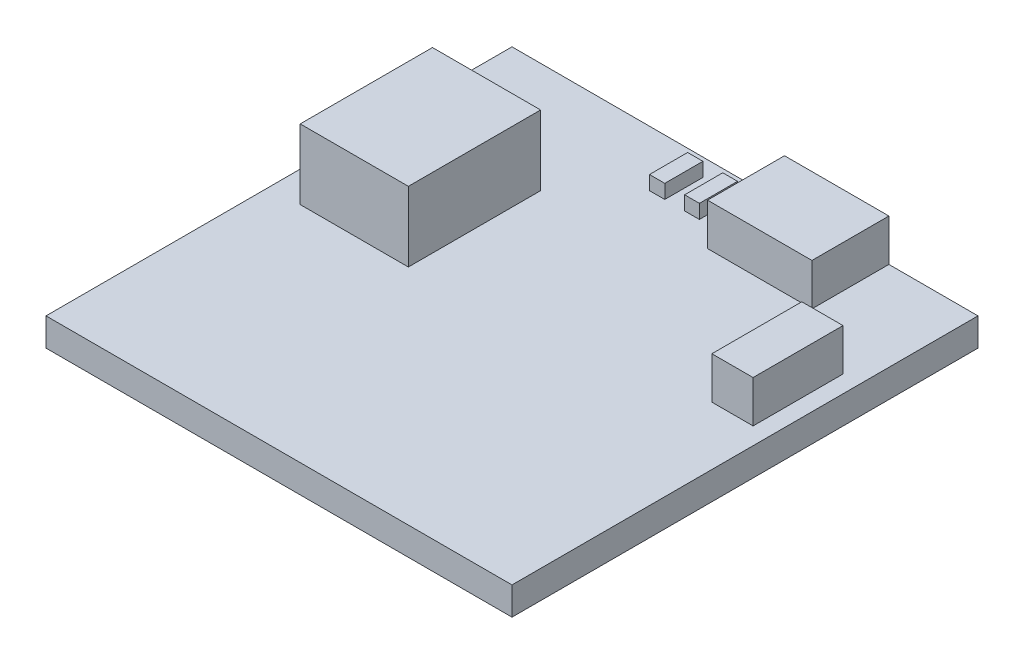
ISO-10303-21;
HEADER;
FILE_DESCRIPTION(('STEP AP214'),'2;1');
FILE_NAME('part.step','',(''),(''),'','','');
FILE_SCHEMA(('AUTOMOTIVE_DESIGN { 1 0 10303 214 1 1 1 1 }'));
ENDSEC;
DATA;
#1=APPLICATION_CONTEXT('core data for automotive mechanical design processes');
#2=APPLICATION_PROTOCOL_DEFINITION('international standard','automotive_design',2000,#1);
#3=PRODUCT_CONTEXT('',#1,'mechanical');
#4=PRODUCT('Part','Part','',(#3));
#5=PRODUCT_RELATED_PRODUCT_CATEGORY('part','',(#4));
#6=PRODUCT_DEFINITION_FORMATION('','',#4);
#7=PRODUCT_DEFINITION_CONTEXT('part definition',#1,'design');
#8=PRODUCT_DEFINITION('design','',#6,#7);
#9=PRODUCT_DEFINITION_SHAPE('','',#8);
#10=(LENGTH_UNIT() NAMED_UNIT(*) SI_UNIT(.MILLI.,.METRE.));
#11=(NAMED_UNIT(*) PLANE_ANGLE_UNIT() SI_UNIT($,.RADIAN.));
#12=(NAMED_UNIT(*) SI_UNIT($,.STERADIAN.) SOLID_ANGLE_UNIT());
#13=UNCERTAINTY_MEASURE_WITH_UNIT(LENGTH_MEASURE(1.E-05),#10,'distance_accuracy_value','');
#14=(GEOMETRIC_REPRESENTATION_CONTEXT(3) GLOBAL_UNCERTAINTY_ASSIGNED_CONTEXT((#13)) GLOBAL_UNIT_ASSIGNED_CONTEXT((#10,
#11,#12)) REPRESENTATION_CONTEXT('',''));
#15=CARTESIAN_POINT('',(0.,0.,0.));
#16=DIRECTION('',(0.,0.,1.));
#17=DIRECTION('',(1.,0.,0.));
#18=AXIS2_PLACEMENT_3D('',#15,#16,#17);
#19=CARTESIAN_POINT('',(0.,2.,0.));
#20=DIRECTION('',(0.,-1.,0.));
#21=DIRECTION('',(0.,0.,-1.));
#22=AXIS2_PLACEMENT_3D('',#19,#20,#21);
#23=PLANE('',#22);
#24=DIRECTION('',(0.,0.,1.));
#25=VECTOR('',#24,1.);
#26=CARTESIAN_POINT('',(16.3428825691909,2.,-32.0730091965515));
#27=LINE('',#26,#25);
#28=CARTESIAN_POINT('',(16.3428825691909,2.,-32.0730091965515));
#29=VERTEX_POINT('',#28);
#30=CARTESIAN_POINT('',(16.3428825691909,2.,-29.343463743615));
#31=VERTEX_POINT('',#30);
#32=EDGE_CURVE('E216',#29,#31,#27,.T.);
#33=ORIENTED_EDGE('',*,*,#32,.F.);
#34=DIRECTION('',(-1.,0.,0.));
#35=VECTOR('',#34,1.);
#36=CARTESIAN_POINT('',(16.3428825691909,2.,-32.0730091965515));
#37=LINE('',#36,#35);
#38=CARTESIAN_POINT('',(17.3998755148403,2.,-32.0730091965515));
#39=VERTEX_POINT('',#38);
#40=EDGE_CURVE('E229',#39,#29,#37,.T.);
#41=ORIENTED_EDGE('',*,*,#40,.F.);
#42=DIRECTION('',(0.,0.,-1.));
#43=VECTOR('',#42,1.);
#44=CARTESIAN_POINT('',(17.3998755148403,2.,-32.0730091965515));
#45=LINE('',#44,#43);
#46=CARTESIAN_POINT('',(17.3998755148403,2.,-29.343463743615));
#47=VERTEX_POINT('',#46);
#48=EDGE_CURVE('E238',#47,#39,#45,.T.);
#49=ORIENTED_EDGE('',*,*,#48,.F.);
#50=DIRECTION('',(1.,0.,0.));
#51=VECTOR('',#50,1.);
#52=CARTESIAN_POINT('',(16.3428825691909,2.,-29.343463743615));
#53=LINE('',#52,#51);
#54=EDGE_CURVE('E219',#31,#47,#53,.T.);
#55=ORIENTED_EDGE('',*,*,#54,.F.);
#56=EDGE_LOOP('',(#33,#41,#49,#55));
#57=FACE_BOUND('',#56,.T.);
#58=DIRECTION('',(0.,0.,1.));
#59=VECTOR('',#58,1.);
#60=CARTESIAN_POINT('',(29.164191470116,2.,-24.907830622567));
#61=LINE('',#60,#59);
#62=CARTESIAN_POINT('',(29.164191470116,2.,-24.907830622567));
#63=VERTEX_POINT('',#62);
#64=CARTESIAN_POINT('',(29.164191470116,2.,-18.471844319663));
#65=VERTEX_POINT('',#64);
#66=EDGE_CURVE('E287',#63,#65,#61,.T.);
#67=ORIENTED_EDGE('',*,*,#66,.F.);
#68=DIRECTION('',(-1.,0.,0.));
#69=VECTOR('',#68,1.);
#70=CARTESIAN_POINT('',(29.164191470116,2.,-24.907830622567));
#71=LINE('',#70,#69);
#72=CARTESIAN_POINT('',(32.1120457232311,2.,-24.907830622567));
#73=VERTEX_POINT('',#72);
#74=EDGE_CURVE('E292',#73,#63,#71,.T.);
#75=ORIENTED_EDGE('',*,*,#74,.F.);
#76=DIRECTION('',(0.,0.,-1.));
#77=VECTOR('',#76,1.);
#78=CARTESIAN_POINT('',(32.1120457232311,2.,-24.907830622567));
#79=LINE('',#78,#77);
#80=CARTESIAN_POINT('',(32.1120457232311,2.,-18.471844319663));
#81=VERTEX_POINT('',#80);
#82=EDGE_CURVE('E304',#81,#73,#79,.T.);
#83=ORIENTED_EDGE('',*,*,#82,.F.);
#84=DIRECTION('',(1.,0.,0.));
#85=VECTOR('',#84,1.);
#86=CARTESIAN_POINT('',(29.164191470116,2.,-18.471844319663));
#87=LINE('',#86,#85);
#88=EDGE_CURVE('E301',#65,#81,#87,.T.);
#89=ORIENTED_EDGE('',*,*,#88,.F.);
#90=EDGE_LOOP('',(#67,#75,#83,#89));
#91=FACE_BOUND('',#90,.T.);
#92=DIRECTION('',(0.,0.,1.));
#93=VECTOR('',#92,1.);
#94=CARTESIAN_POINT('',(2.19932214853813,2.,-25.448709163399));
#95=LINE('',#94,#93);
#96=CARTESIAN_POINT('',(2.19932214853813,2.,-25.448709163399));
#97=VERTEX_POINT('',#96);
#98=CARTESIAN_POINT('',(2.19932214853813,2.,-15.9873637144443));
#99=VERTEX_POINT('',#98);
#100=EDGE_CURVE('E320',#97,#99,#95,.T.);
#101=ORIENTED_EDGE('',*,*,#100,.F.);
#102=DIRECTION('',(-1.,0.,0.));
#103=VECTOR('',#102,1.);
#104=CARTESIAN_POINT('',(2.19932214853813,2.,-25.448709163399));
#105=LINE('',#104,#103);
#106=CARTESIAN_POINT('',(9.93540559789352,2.,-25.448709163399));
#107=VERTEX_POINT('',#106);
#108=EDGE_CURVE('E325',#107,#97,#105,.T.);
#109=ORIENTED_EDGE('',*,*,#108,.F.);
#110=DIRECTION('',(0.,0.,-1.));
#111=VECTOR('',#110,1.);
#112=CARTESIAN_POINT('',(9.93540559789352,2.,-25.448709163399));
#113=LINE('',#112,#111);
#114=CARTESIAN_POINT('',(9.93540559789352,2.,-15.9873637144443));
#115=VERTEX_POINT('',#114);
#116=EDGE_CURVE('E337',#115,#107,#113,.T.);
#117=ORIENTED_EDGE('',*,*,#116,.F.);
#118=DIRECTION('',(1.,0.,0.));
#119=VECTOR('',#118,1.);
#120=CARTESIAN_POINT('',(2.19932214853813,2.,-15.9873637144443));
#121=LINE('',#120,#119);
#122=EDGE_CURVE('E334',#99,#115,#121,.T.);
#123=ORIENTED_EDGE('',*,*,#122,.F.);
#124=EDGE_LOOP('',(#101,#109,#117,#123));
#125=FACE_BOUND('',#124,.T.);
#126=DIRECTION('',(0.,0.,1.));
#127=VECTOR('',#126,1.);
#128=CARTESIAN_POINT('',(13.8287826634453,2.,-32.0730091965515));
#129=LINE('',#128,#127);
#130=CARTESIAN_POINT('',(13.8287826634453,2.,-32.0730091965515));
#131=VERTEX_POINT('',#130);
#132=CARTESIAN_POINT('',(13.8287826634453,2.,-29.343463743615));
#133=VERTEX_POINT('',#132);
#134=EDGE_CURVE('E254',#131,#133,#129,.T.);
#135=ORIENTED_EDGE('',*,*,#134,.F.);
#136=DIRECTION('',(-1.,0.,0.));
#137=VECTOR('',#136,1.);
#138=CARTESIAN_POINT('',(13.8287826634453,2.,-32.0730091965515));
#139=LINE('',#138,#137);
#140=CARTESIAN_POINT('',(14.9221740487633,2.,-32.0730091965515));
#141=VERTEX_POINT('',#140);
#142=EDGE_CURVE('E259',#141,#131,#139,.T.);
#143=ORIENTED_EDGE('',*,*,#142,.F.);
#144=DIRECTION('',(0.,0.,-1.));
#145=VECTOR('',#144,1.);
#146=CARTESIAN_POINT('',(14.9221740487633,2.,-32.0730091965515));
#147=LINE('',#146,#145);
#148=CARTESIAN_POINT('',(14.9221740487633,2.,-29.343463743615));
#149=VERTEX_POINT('',#148);
#150=EDGE_CURVE('E271',#149,#141,#147,.T.);
#151=ORIENTED_EDGE('',*,*,#150,.F.);
#152=DIRECTION('',(1.,0.,0.));
#153=VECTOR('',#152,1.);
#154=CARTESIAN_POINT('',(13.8287826634453,2.,-29.343463743615));
#155=LINE('',#154,#153);
#156=EDGE_CURVE('E268',#133,#149,#155,.T.);
#157=ORIENTED_EDGE('',*,*,#156,.F.);
#158=EDGE_LOOP('',(#135,#143,#151,#157));
#159=FACE_BOUND('',#158,.T.);
#160=DIRECTION('',(0.,0.,1.));
#161=VECTOR('',#160,1.);
#162=CARTESIAN_POINT('',(19.4955277753479,2.,-27.8321206305776));
#163=LINE('',#162,#161);
#164=CARTESIAN_POINT('',(19.4955277753479,2.,-33.3375));
#165=VERTEX_POINT('',#164);
#166=CARTESIAN_POINT('',(19.4955277753479,2.,-27.8321206305776));
#167=VERTEX_POINT('',#166);
#168=EDGE_CURVE('E215',#165,#167,#163,.T.);
#169=ORIENTED_EDGE('',*,*,#168,.F.);
#170=DIRECTION('',(-1.,0.,0.));
#171=VECTOR('',#170,1.);
#172=CARTESIAN_POINT('',(0.,2.,-33.3375));
#173=LINE('',#172,#171);
#174=CARTESIAN_POINT('',(0.,2.,-33.3375));
#175=VERTEX_POINT('',#174);
#176=EDGE_CURVE('E362',#165,#175,#173,.T.);
#177=ORIENTED_EDGE('',*,*,#176,.T.);
#178=DIRECTION('',(0.,0.,1.));
#179=VECTOR('',#178,1.);
#180=CARTESIAN_POINT('',(0.,2.,0.));
#181=LINE('',#180,#179);
#182=CARTESIAN_POINT('',(0.,2.,0.));
#183=VERTEX_POINT('',#182);
#184=EDGE_CURVE('E354',#175,#183,#181,.T.);
#185=ORIENTED_EDGE('',*,*,#184,.T.);
#186=DIRECTION('',(1.,0.,0.));
#187=VECTOR('',#186,1.);
#188=CARTESIAN_POINT('',(0.,2.,0.));
#189=LINE('',#188,#187);
#190=CARTESIAN_POINT('',(33.3375,2.,0.));
#191=VERTEX_POINT('',#190);
#192=EDGE_CURVE('E357',#183,#191,#189,.T.);
#193=ORIENTED_EDGE('',*,*,#192,.T.);
#194=DIRECTION('',(0.,0.,-1.));
#195=VECTOR('',#194,1.);
#196=CARTESIAN_POINT('',(33.3375,2.,0.));
#197=LINE('',#196,#195);
#198=CARTESIAN_POINT('',(33.3375,2.,-33.3375));
#199=VERTEX_POINT('',#198);
#200=EDGE_CURVE('E360',#191,#199,#197,.T.);
#201=ORIENTED_EDGE('',*,*,#200,.T.);
#202=CARTESIAN_POINT('',(26.9636112351321,2.,-33.3375));
#203=VERTEX_POINT('',#202);
#204=EDGE_CURVE('E363',#199,#203,#173,.T.);
#205=ORIENTED_EDGE('',*,*,#204,.T.);
#206=DIRECTION('',(0.,0.,-1.));
#207=VECTOR('',#206,1.);
#208=CARTESIAN_POINT('',(26.9636112351321,2.,-27.8321206305776));
#209=LINE('',#208,#207);
#210=CARTESIAN_POINT('',(26.9636112351321,2.,-27.8321206305776));
#211=VERTEX_POINT('',#210);
#212=EDGE_CURVE('E54',#211,#203,#209,.T.);
#213=ORIENTED_EDGE('',*,*,#212,.F.);
#214=DIRECTION('',(1.,0.,0.));
#215=VECTOR('',#214,1.);
#216=CARTESIAN_POINT('',(19.4955277753479,2.,-27.8321206305776));
#217=LINE('',#216,#215);
#218=EDGE_CURVE('E49',#167,#211,#217,.T.);
#219=ORIENTED_EDGE('',*,*,#218,.F.);
#220=EDGE_LOOP('',(#169,#177,#185,#193,#201,#205,#213,#219));
#221=FACE_BOUND('',#220,.T.);
#222=ADVANCED_FACE('F34',(#57,#91,#125,#159,#221),#23,.F.);
#223=CARTESIAN_POINT('',(0.,2.,0.));
#224=DIRECTION('',(1.,0.,0.));
#225=DIRECTION('',(0.,0.,-1.));
#226=AXIS2_PLACEMENT_3D('',#223,#224,#225);
#227=PLANE('',#226);
#228=DIRECTION('',(0.,0.,1.));
#229=VECTOR('',#228,1.);
#230=CARTESIAN_POINT('',(0.,0.,0.));
#231=LINE('',#230,#229);
#232=CARTESIAN_POINT('',(0.,0.,-33.3375));
#233=VERTEX_POINT('',#232);
#234=CARTESIAN_POINT('',(0.,0.,0.));
#235=VERTEX_POINT('',#234);
#236=EDGE_CURVE('E353',#233,#235,#231,.T.);
#237=ORIENTED_EDGE('',*,*,#236,.T.);
#238=DIRECTION('',(0.,-1.,0.));
#239=VECTOR('',#238,1.);
#240=CARTESIAN_POINT('',(0.,2.,0.));
#241=LINE('',#240,#239);
#242=EDGE_CURVE('E11',#183,#235,#241,.T.);
#243=ORIENTED_EDGE('',*,*,#242,.F.);
#244=ORIENTED_EDGE('',*,*,#184,.F.);
#245=DIRECTION('',(0.,-1.,0.));
#246=VECTOR('',#245,1.);
#247=CARTESIAN_POINT('',(0.,2.,-33.3375));
#248=LINE('',#247,#246);
#249=EDGE_CURVE('E365',#175,#233,#248,.T.);
#250=ORIENTED_EDGE('',*,*,#249,.T.);
#251=EDGE_LOOP('',(#237,#243,#244,#250));
#252=FACE_BOUND('',#251,.T.);
#253=ADVANCED_FACE('F36',(#252),#227,.F.);
#254=CARTESIAN_POINT('',(0.,2.,0.));
#255=DIRECTION('',(0.,0.,-1.));
#256=DIRECTION('',(-1.,0.,0.));
#257=AXIS2_PLACEMENT_3D('',#254,#255,#256);
#258=PLANE('',#257);
#259=DIRECTION('',(1.,0.,0.));
#260=VECTOR('',#259,1.);
#261=CARTESIAN_POINT('',(0.,0.,0.));
#262=LINE('',#261,#260);
#263=CARTESIAN_POINT('',(33.3375,0.,0.));
#264=VERTEX_POINT('',#263);
#265=EDGE_CURVE('E368',#235,#264,#262,.T.);
#266=ORIENTED_EDGE('',*,*,#265,.T.);
#267=DIRECTION('',(0.,-1.,0.));
#268=VECTOR('',#267,1.);
#269=CARTESIAN_POINT('',(33.3375,2.,0.));
#270=LINE('',#269,#268);
#271=EDGE_CURVE('E42',#191,#264,#270,.T.);
#272=ORIENTED_EDGE('',*,*,#271,.F.);
#273=ORIENTED_EDGE('',*,*,#192,.F.);
#274=ORIENTED_EDGE('',*,*,#242,.T.);
#275=EDGE_LOOP('',(#266,#272,#273,#274));
#276=FACE_BOUND('',#275,.T.);
#277=ADVANCED_FACE('F421',(#276),#258,.F.);
#278=CARTESIAN_POINT('',(33.3375,2.,0.));
#279=DIRECTION('',(-1.,0.,0.));
#280=DIRECTION('',(0.,0.,1.));
#281=AXIS2_PLACEMENT_3D('',#278,#279,#280);
#282=PLANE('',#281);
#283=DIRECTION('',(0.,0.,-1.));
#284=VECTOR('',#283,1.);
#285=CARTESIAN_POINT('',(33.3375,0.,0.));
#286=LINE('',#285,#284);
#287=CARTESIAN_POINT('',(33.3375,0.,-33.3375));
#288=VERTEX_POINT('',#287);
#289=EDGE_CURVE('E370',#264,#288,#286,.T.);
#290=ORIENTED_EDGE('',*,*,#289,.T.);
#291=DIRECTION('',(0.,-1.,0.));
#292=VECTOR('',#291,1.);
#293=CARTESIAN_POINT('',(33.3375,2.,-33.3375));
#294=LINE('',#293,#292);
#295=EDGE_CURVE('E375',#199,#288,#294,.T.);
#296=ORIENTED_EDGE('',*,*,#295,.F.);
#297=ORIENTED_EDGE('',*,*,#200,.F.);
#298=ORIENTED_EDGE('',*,*,#271,.T.);
#299=EDGE_LOOP('',(#290,#296,#297,#298));
#300=FACE_BOUND('',#299,.T.);
#301=ADVANCED_FACE('F382',(#300),#282,.F.);
#302=CARTESIAN_POINT('',(0.,2.,-33.3375));
#303=DIRECTION('',(0.,0.,1.));
#304=DIRECTION('',(1.,0.,0.));
#305=AXIS2_PLACEMENT_3D('',#302,#303,#304);
#306=PLANE('',#305);
#307=DIRECTION('',(-1.,0.,0.));
#308=VECTOR('',#307,1.);
#309=CARTESIAN_POINT('',(0.,0.,-33.3375));
#310=LINE('',#309,#308);
#311=EDGE_CURVE('E358',#288,#233,#310,.T.);
#312=ORIENTED_EDGE('',*,*,#311,.T.);
#313=ORIENTED_EDGE('',*,*,#249,.F.);
#314=ORIENTED_EDGE('',*,*,#176,.F.);
#315=DIRECTION('',(0.,-1.,0.));
#316=VECTOR('',#315,1.);
#317=CARTESIAN_POINT('',(19.4955277753479,5.,-33.3375));
#318=LINE('',#317,#316);
#319=CARTESIAN_POINT('',(19.4955277753479,5.,-33.3375));
#320=VERTEX_POINT('',#319);
#321=EDGE_CURVE('E396',#320,#165,#318,.T.);
#322=ORIENTED_EDGE('',*,*,#321,.F.);
#323=DIRECTION('',(-1.,0.,0.));
#324=VECTOR('',#323,1.);
#325=CARTESIAN_POINT('',(19.4955277753479,5.,-33.3375));
#326=LINE('',#325,#324);
#327=CARTESIAN_POINT('',(26.9636112351321,5.,-33.3375));
#328=VERTEX_POINT('',#327);
#329=EDGE_CURVE('E209',#328,#320,#326,.T.);
#330=ORIENTED_EDGE('',*,*,#329,.F.);
#331=DIRECTION('',(0.,-1.,0.));
#332=VECTOR('',#331,1.);
#333=CARTESIAN_POINT('',(26.9636112351321,5.,-33.3375));
#334=LINE('',#333,#332);
#335=EDGE_CURVE('E221',#328,#203,#334,.T.);
#336=ORIENTED_EDGE('',*,*,#335,.T.);
#337=ORIENTED_EDGE('',*,*,#204,.F.);
#338=ORIENTED_EDGE('',*,*,#295,.T.);
#339=EDGE_LOOP('',(#312,#313,#314,#322,#330,#336,#337,#338));
#340=FACE_BOUND('',#339,.T.);
#341=ADVANCED_FACE('F391',(#340),#306,.F.);
#342=CARTESIAN_POINT('',(0.,0.,0.));
#343=DIRECTION('',(0.,-1.,0.));
#344=DIRECTION('',(0.,0.,-1.));
#345=AXIS2_PLACEMENT_3D('',#342,#343,#344);
#346=PLANE('',#345);
#347=ORIENTED_EDGE('',*,*,#236,.F.);
#348=ORIENTED_EDGE('',*,*,#311,.F.);
#349=ORIENTED_EDGE('',*,*,#289,.F.);
#350=ORIENTED_EDGE('',*,*,#265,.F.);
#351=EDGE_LOOP('',(#347,#348,#349,#350));
#352=FACE_BOUND('',#351,.T.);
#353=ADVANCED_FACE('F388',(#352),#346,.T.);
#354=CARTESIAN_POINT('',(2.19932214853813,7.,-25.448709163399));
#355=DIRECTION('',(1.,0.,0.));
#356=DIRECTION('',(0.,0.,-1.));
#357=AXIS2_PLACEMENT_3D('',#354,#355,#356);
#358=PLANE('',#357);
#359=ORIENTED_EDGE('',*,*,#100,.T.);
#360=DIRECTION('',(0.,-1.,0.));
#361=VECTOR('',#360,1.);
#362=CARTESIAN_POINT('',(2.19932214853813,7.,-15.9873637144443));
#363=LINE('',#362,#361);
#364=CARTESIAN_POINT('',(2.19932214853813,7.,-15.9873637144443));
#365=VERTEX_POINT('',#364);
#366=EDGE_CURVE('E350',#365,#99,#363,.T.);
#367=ORIENTED_EDGE('',*,*,#366,.F.);
#368=DIRECTION('',(0.,0.,1.));
#369=VECTOR('',#368,1.);
#370=CARTESIAN_POINT('',(2.19932214853813,7.,-25.448709163399));
#371=LINE('',#370,#369);
#372=CARTESIAN_POINT('',(2.19932214853813,7.,-25.448709163399));
#373=VERTEX_POINT('',#372);
#374=EDGE_CURVE('E321',#373,#365,#371,.T.);
#375=ORIENTED_EDGE('',*,*,#374,.F.);
#376=DIRECTION('',(0.,-1.,0.));
#377=VECTOR('',#376,1.);
#378=CARTESIAN_POINT('',(2.19932214853813,7.,-25.448709163399));
#379=LINE('',#378,#377);
#380=EDGE_CURVE('E331',#373,#97,#379,.T.);
#381=ORIENTED_EDGE('',*,*,#380,.T.);
#382=EDGE_LOOP('',(#359,#367,#375,#381));
#383=FACE_BOUND('',#382,.T.);
#384=ADVANCED_FACE('F425',(#383),#358,.F.);
#385=CARTESIAN_POINT('',(2.19932214853813,7.,-15.9873637144443));
#386=DIRECTION('',(0.,0.,-1.));
#387=DIRECTION('',(-1.,0.,0.));
#388=AXIS2_PLACEMENT_3D('',#385,#386,#387);
#389=PLANE('',#388);
#390=ORIENTED_EDGE('',*,*,#122,.T.);
#391=DIRECTION('',(0.,-1.,0.));
#392=VECTOR('',#391,1.);
#393=CARTESIAN_POINT('',(9.93540559789352,7.,-15.9873637144443));
#394=LINE('',#393,#392);
#395=CARTESIAN_POINT('',(9.93540559789352,7.,-15.9873637144443));
#396=VERTEX_POINT('',#395);
#397=EDGE_CURVE('E347',#396,#115,#394,.T.);
#398=ORIENTED_EDGE('',*,*,#397,.F.);
#399=DIRECTION('',(1.,0.,0.));
#400=VECTOR('',#399,1.);
#401=CARTESIAN_POINT('',(2.19932214853813,7.,-15.9873637144443));
#402=LINE('',#401,#400);
#403=EDGE_CURVE('E324',#365,#396,#402,.T.);
#404=ORIENTED_EDGE('',*,*,#403,.F.);
#405=ORIENTED_EDGE('',*,*,#366,.T.);
#406=EDGE_LOOP('',(#390,#398,#404,#405));
#407=FACE_BOUND('',#406,.T.);
#408=ADVANCED_FACE('F458',(#407),#389,.F.);
#409=CARTESIAN_POINT('',(9.93540559789352,7.,-25.448709163399));
#410=DIRECTION('',(-1.,0.,0.));
#411=DIRECTION('',(0.,0.,1.));
#412=AXIS2_PLACEMENT_3D('',#409,#410,#411);
#413=PLANE('',#412);
#414=ORIENTED_EDGE('',*,*,#116,.T.);
#415=DIRECTION('',(0.,-1.,0.));
#416=VECTOR('',#415,1.);
#417=CARTESIAN_POINT('',(9.93540559789352,7.,-25.448709163399));
#418=LINE('',#417,#416);
#419=CARTESIAN_POINT('',(9.93540559789352,7.,-25.448709163399));
#420=VERTEX_POINT('',#419);
#421=EDGE_CURVE('E344',#420,#107,#418,.T.);
#422=ORIENTED_EDGE('',*,*,#421,.F.);
#423=DIRECTION('',(0.,0.,-1.));
#424=VECTOR('',#423,1.);
#425=CARTESIAN_POINT('',(9.93540559789352,7.,-25.448709163399));
#426=LINE('',#425,#424);
#427=EDGE_CURVE('E327',#396,#420,#426,.T.);
#428=ORIENTED_EDGE('',*,*,#427,.F.);
#429=ORIENTED_EDGE('',*,*,#397,.T.);
#430=EDGE_LOOP('',(#414,#422,#428,#429));
#431=FACE_BOUND('',#430,.T.);
#432=ADVANCED_FACE('F465',(#431),#413,.F.);
#433=CARTESIAN_POINT('',(2.19932214853813,7.,-25.448709163399));
#434=DIRECTION('',(0.,0.,1.));
#435=DIRECTION('',(1.,0.,0.));
#436=AXIS2_PLACEMENT_3D('',#433,#434,#435);
#437=PLANE('',#436);
#438=ORIENTED_EDGE('',*,*,#108,.T.);
#439=ORIENTED_EDGE('',*,*,#380,.F.);
#440=DIRECTION('',(-1.,0.,0.));
#441=VECTOR('',#440,1.);
#442=CARTESIAN_POINT('',(2.19932214853813,7.,-25.448709163399));
#443=LINE('',#442,#441);
#444=EDGE_CURVE('E329',#420,#373,#443,.T.);
#445=ORIENTED_EDGE('',*,*,#444,.F.);
#446=ORIENTED_EDGE('',*,*,#421,.T.);
#447=EDGE_LOOP('',(#438,#439,#445,#446));
#448=FACE_BOUND('',#447,.T.);
#449=ADVANCED_FACE('F471',(#448),#437,.F.);
#450=CARTESIAN_POINT('',(0.,7.,0.));
#451=DIRECTION('',(0.,1.,0.));
#452=DIRECTION('',(0.,0.,1.));
#453=AXIS2_PLACEMENT_3D('',#450,#451,#452);
#454=PLANE('',#453);
#455=ORIENTED_EDGE('',*,*,#374,.T.);
#456=ORIENTED_EDGE('',*,*,#403,.T.);
#457=ORIENTED_EDGE('',*,*,#427,.T.);
#458=ORIENTED_EDGE('',*,*,#444,.T.);
#459=EDGE_LOOP('',(#455,#456,#457,#458));
#460=FACE_BOUND('',#459,.T.);
#461=ADVANCED_FACE('F479',(#460),#454,.T.);
#462=CARTESIAN_POINT('',(29.164191470116,5.,-24.907830622567));
#463=DIRECTION('',(1.,0.,0.));
#464=DIRECTION('',(0.,0.,-1.));
#465=AXIS2_PLACEMENT_3D('',#462,#463,#464);
#466=PLANE('',#465);
#467=ORIENTED_EDGE('',*,*,#66,.T.);
#468=DIRECTION('',(0.,-1.,0.));
#469=VECTOR('',#468,1.);
#470=CARTESIAN_POINT('',(29.164191470116,5.,-18.471844319663));
#471=LINE('',#470,#469);
#472=CARTESIAN_POINT('',(29.164191470116,5.,-18.471844319663));
#473=VERTEX_POINT('',#472);
#474=EDGE_CURVE('E317',#473,#65,#471,.T.);
#475=ORIENTED_EDGE('',*,*,#474,.F.);
#476=DIRECTION('',(0.,0.,1.));
#477=VECTOR('',#476,1.);
#478=CARTESIAN_POINT('',(29.164191470116,5.,-24.907830622567));
#479=LINE('',#478,#477);
#480=CARTESIAN_POINT('',(29.164191470116,5.,-24.907830622567));
#481=VERTEX_POINT('',#480);
#482=EDGE_CURVE('E288',#481,#473,#479,.T.);
#483=ORIENTED_EDGE('',*,*,#482,.F.);
#484=DIRECTION('',(0.,-1.,0.));
#485=VECTOR('',#484,1.);
#486=CARTESIAN_POINT('',(29.164191470116,5.,-24.907830622567));
#487=LINE('',#486,#485);
#488=EDGE_CURVE('E298',#481,#63,#487,.T.);
#489=ORIENTED_EDGE('',*,*,#488,.T.);
#490=EDGE_LOOP('',(#467,#475,#483,#489));
#491=FACE_BOUND('',#490,.T.);
#492=ADVANCED_FACE('F487',(#491),#466,.F.);
#493=CARTESIAN_POINT('',(29.164191470116,5.,-18.471844319663));
#494=DIRECTION('',(0.,0.,-1.));
#495=DIRECTION('',(-1.,0.,0.));
#496=AXIS2_PLACEMENT_3D('',#493,#494,#495);
#497=PLANE('',#496);
#498=ORIENTED_EDGE('',*,*,#88,.T.);
#499=DIRECTION('',(0.,-1.,0.));
#500=VECTOR('',#499,1.);
#501=CARTESIAN_POINT('',(32.1120457232311,5.,-18.471844319663));
#502=LINE('',#501,#500);
#503=CARTESIAN_POINT('',(32.1120457232311,5.,-18.471844319663));
#504=VERTEX_POINT('',#503);
#505=EDGE_CURVE('E314',#504,#81,#502,.T.);
#506=ORIENTED_EDGE('',*,*,#505,.F.);
#507=DIRECTION('',(1.,0.,0.));
#508=VECTOR('',#507,1.);
#509=CARTESIAN_POINT('',(29.164191470116,5.,-18.471844319663));
#510=LINE('',#509,#508);
#511=EDGE_CURVE('E291',#473,#504,#510,.T.);
#512=ORIENTED_EDGE('',*,*,#511,.F.);
#513=ORIENTED_EDGE('',*,*,#474,.T.);
#514=EDGE_LOOP('',(#498,#506,#512,#513));
#515=FACE_BOUND('',#514,.T.);
#516=ADVANCED_FACE('F496',(#515),#497,.F.);
#517=CARTESIAN_POINT('',(32.1120457232311,5.,-24.907830622567));
#518=DIRECTION('',(-1.,0.,0.));
#519=DIRECTION('',(0.,0.,1.));
#520=AXIS2_PLACEMENT_3D('',#517,#518,#519);
#521=PLANE('',#520);
#522=ORIENTED_EDGE('',*,*,#82,.T.);
#523=DIRECTION('',(0.,-1.,0.));
#524=VECTOR('',#523,1.);
#525=CARTESIAN_POINT('',(32.1120457232311,5.,-24.907830622567));
#526=LINE('',#525,#524);
#527=CARTESIAN_POINT('',(32.1120457232311,5.,-24.907830622567));
#528=VERTEX_POINT('',#527);
#529=EDGE_CURVE('E311',#528,#73,#526,.T.);
#530=ORIENTED_EDGE('',*,*,#529,.F.);
#531=DIRECTION('',(0.,0.,-1.));
#532=VECTOR('',#531,1.);
#533=CARTESIAN_POINT('',(32.1120457232311,5.,-24.907830622567));
#534=LINE('',#533,#532);
#535=EDGE_CURVE('E294',#504,#528,#534,.T.);
#536=ORIENTED_EDGE('',*,*,#535,.F.);
#537=ORIENTED_EDGE('',*,*,#505,.T.);
#538=EDGE_LOOP('',(#522,#530,#536,#537));
#539=FACE_BOUND('',#538,.T.);
#540=ADVANCED_FACE('F504',(#539),#521,.F.);
#541=CARTESIAN_POINT('',(29.164191470116,5.,-24.907830622567));
#542=DIRECTION('',(0.,0.,1.));
#543=DIRECTION('',(1.,0.,0.));
#544=AXIS2_PLACEMENT_3D('',#541,#542,#543);
#545=PLANE('',#544);
#546=ORIENTED_EDGE('',*,*,#74,.T.);
#547=ORIENTED_EDGE('',*,*,#488,.F.);
#548=DIRECTION('',(-1.,0.,0.));
#549=VECTOR('',#548,1.);
#550=CARTESIAN_POINT('',(29.164191470116,5.,-24.907830622567));
#551=LINE('',#550,#549);
#552=EDGE_CURVE('E296',#528,#481,#551,.T.);
#553=ORIENTED_EDGE('',*,*,#552,.F.);
#554=ORIENTED_EDGE('',*,*,#529,.T.);
#555=EDGE_LOOP('',(#546,#547,#553,#554));
#556=FACE_BOUND('',#555,.T.);
#557=ADVANCED_FACE('F512',(#556),#545,.F.);
#558=CARTESIAN_POINT('',(0.,5.,0.));
#559=DIRECTION('',(0.,1.,0.));
#560=DIRECTION('',(0.,0.,1.));
#561=AXIS2_PLACEMENT_3D('',#558,#559,#560);
#562=PLANE('',#561);
#563=ORIENTED_EDGE('',*,*,#482,.T.);
#564=ORIENTED_EDGE('',*,*,#511,.T.);
#565=ORIENTED_EDGE('',*,*,#535,.T.);
#566=ORIENTED_EDGE('',*,*,#552,.T.);
#567=EDGE_LOOP('',(#563,#564,#565,#566));
#568=FACE_BOUND('',#567,.T.);
#569=ADVANCED_FACE('F519',(#568),#562,.T.);
#570=CARTESIAN_POINT('',(13.8287826634453,3.,-32.0730091965515));
#571=DIRECTION('',(1.,0.,0.));
#572=DIRECTION('',(0.,0.,-1.));
#573=AXIS2_PLACEMENT_3D('',#570,#571,#572);
#574=PLANE('',#573);
#575=ORIENTED_EDGE('',*,*,#134,.T.);
#576=DIRECTION('',(0.,-1.,0.));
#577=VECTOR('',#576,1.);
#578=CARTESIAN_POINT('',(13.8287826634453,3.,-29.343463743615));
#579=LINE('',#578,#577);
#580=CARTESIAN_POINT('',(13.8287826634453,3.,-29.343463743615));
#581=VERTEX_POINT('',#580);
#582=EDGE_CURVE('E284',#581,#133,#579,.T.);
#583=ORIENTED_EDGE('',*,*,#582,.F.);
#584=DIRECTION('',(0.,0.,1.));
#585=VECTOR('',#584,1.);
#586=CARTESIAN_POINT('',(13.8287826634453,3.,-32.0730091965515));
#587=LINE('',#586,#585);
#588=CARTESIAN_POINT('',(13.8287826634453,3.,-32.0730091965515));
#589=VERTEX_POINT('',#588);
#590=EDGE_CURVE('E255',#589,#581,#587,.T.);
#591=ORIENTED_EDGE('',*,*,#590,.F.);
#592=DIRECTION('',(0.,-1.,0.));
#593=VECTOR('',#592,1.);
#594=CARTESIAN_POINT('',(13.8287826634453,3.,-32.0730091965515));
#595=LINE('',#594,#593);
#596=EDGE_CURVE('E265',#589,#131,#595,.T.);
#597=ORIENTED_EDGE('',*,*,#596,.T.);
#598=EDGE_LOOP('',(#575,#583,#591,#597));
#599=FACE_BOUND('',#598,.T.);
#600=ADVANCED_FACE('F527',(#599),#574,.F.);
#601=CARTESIAN_POINT('',(13.8287826634453,3.,-29.343463743615));
#602=DIRECTION('',(0.,0.,-1.));
#603=DIRECTION('',(-1.,0.,0.));
#604=AXIS2_PLACEMENT_3D('',#601,#602,#603);
#605=PLANE('',#604);
#606=ORIENTED_EDGE('',*,*,#156,.T.);
#607=DIRECTION('',(0.,-1.,0.));
#608=VECTOR('',#607,1.);
#609=CARTESIAN_POINT('',(14.9221740487633,3.,-29.343463743615));
#610=LINE('',#609,#608);
#611=CARTESIAN_POINT('',(14.9221740487633,3.,-29.343463743615));
#612=VERTEX_POINT('',#611);
#613=EDGE_CURVE('E281',#612,#149,#610,.T.);
#614=ORIENTED_EDGE('',*,*,#613,.F.);
#615=DIRECTION('',(1.,0.,0.));
#616=VECTOR('',#615,1.);
#617=CARTESIAN_POINT('',(13.8287826634453,3.,-29.343463743615));
#618=LINE('',#617,#616);
#619=EDGE_CURVE('E258',#581,#612,#618,.T.);
#620=ORIENTED_EDGE('',*,*,#619,.F.);
#621=ORIENTED_EDGE('',*,*,#582,.T.);
#622=EDGE_LOOP('',(#606,#614,#620,#621));
#623=FACE_BOUND('',#622,.T.);
#624=ADVANCED_FACE('F536',(#623),#605,.F.);
#625=CARTESIAN_POINT('',(14.9221740487633,3.,-32.0730091965515));
#626=DIRECTION('',(-1.,0.,0.));
#627=DIRECTION('',(0.,0.,1.));
#628=AXIS2_PLACEMENT_3D('',#625,#626,#627);
#629=PLANE('',#628);
#630=ORIENTED_EDGE('',*,*,#150,.T.);
#631=DIRECTION('',(0.,-1.,0.));
#632=VECTOR('',#631,1.);
#633=CARTESIAN_POINT('',(14.9221740487633,3.,-32.0730091965515));
#634=LINE('',#633,#632);
#635=CARTESIAN_POINT('',(14.9221740487633,3.,-32.0730091965515));
#636=VERTEX_POINT('',#635);
#637=EDGE_CURVE('E278',#636,#141,#634,.T.);
#638=ORIENTED_EDGE('',*,*,#637,.F.);
#639=DIRECTION('',(0.,0.,-1.));
#640=VECTOR('',#639,1.);
#641=CARTESIAN_POINT('',(14.9221740487633,3.,-32.0730091965515));
#642=LINE('',#641,#640);
#643=EDGE_CURVE('E261',#612,#636,#642,.T.);
#644=ORIENTED_EDGE('',*,*,#643,.F.);
#645=ORIENTED_EDGE('',*,*,#613,.T.);
#646=EDGE_LOOP('',(#630,#638,#644,#645));
#647=FACE_BOUND('',#646,.T.);
#648=ADVANCED_FACE('F545',(#647),#629,.F.);
#649=CARTESIAN_POINT('',(13.8287826634453,3.,-32.0730091965515));
#650=DIRECTION('',(0.,0.,1.));
#651=DIRECTION('',(1.,0.,0.));
#652=AXIS2_PLACEMENT_3D('',#649,#650,#651);
#653=PLANE('',#652);
#654=ORIENTED_EDGE('',*,*,#142,.T.);
#655=ORIENTED_EDGE('',*,*,#596,.F.);
#656=DIRECTION('',(-1.,0.,0.));
#657=VECTOR('',#656,1.);
#658=CARTESIAN_POINT('',(13.8287826634453,3.,-32.0730091965515));
#659=LINE('',#658,#657);
#660=EDGE_CURVE('E263',#636,#589,#659,.T.);
#661=ORIENTED_EDGE('',*,*,#660,.F.);
#662=ORIENTED_EDGE('',*,*,#637,.T.);
#663=EDGE_LOOP('',(#654,#655,#661,#662));
#664=FACE_BOUND('',#663,.T.);
#665=ADVANCED_FACE('F553',(#664),#653,.F.);
#666=CARTESIAN_POINT('',(0.,3.,0.));
#667=DIRECTION('',(0.,1.,0.));
#668=DIRECTION('',(0.,0.,1.));
#669=AXIS2_PLACEMENT_3D('',#666,#667,#668);
#670=PLANE('',#669);
#671=ORIENTED_EDGE('',*,*,#590,.T.);
#672=ORIENTED_EDGE('',*,*,#619,.T.);
#673=ORIENTED_EDGE('',*,*,#643,.T.);
#674=ORIENTED_EDGE('',*,*,#660,.T.);
#675=EDGE_LOOP('',(#671,#672,#673,#674));
#676=FACE_BOUND('',#675,.T.);
#677=ADVANCED_FACE('F561',(#676),#670,.T.);
#678=CARTESIAN_POINT('',(16.3428825691909,3.,-32.0730091965515));
#679=DIRECTION('',(1.,0.,0.));
#680=DIRECTION('',(0.,0.,-1.));
#681=AXIS2_PLACEMENT_3D('',#678,#679,#680);
#682=PLANE('',#681);
#683=ORIENTED_EDGE('',*,*,#32,.T.);
#684=DIRECTION('',(0.,-1.,0.));
#685=VECTOR('',#684,1.);
#686=CARTESIAN_POINT('',(16.3428825691909,3.,-29.343463743615));
#687=LINE('',#686,#685);
#688=CARTESIAN_POINT('',(16.3428825691909,3.,-29.343463743615));
#689=VERTEX_POINT('',#688);
#690=EDGE_CURVE('E251',#689,#31,#687,.T.);
#691=ORIENTED_EDGE('',*,*,#690,.F.);
#692=DIRECTION('',(0.,0.,1.));
#693=VECTOR('',#692,1.);
#694=CARTESIAN_POINT('',(16.3428825691909,3.,-32.0730091965515));
#695=LINE('',#694,#693);
#696=CARTESIAN_POINT('',(16.3428825691909,3.,-32.0730091965515));
#697=VERTEX_POINT('',#696);
#698=EDGE_CURVE('E225',#697,#689,#695,.T.);
#699=ORIENTED_EDGE('',*,*,#698,.F.);
#700=DIRECTION('',(0.,-1.,0.));
#701=VECTOR('',#700,1.);
#702=CARTESIAN_POINT('',(16.3428825691909,3.,-32.0730091965515));
#703=LINE('',#702,#701);
#704=EDGE_CURVE('E234',#697,#29,#703,.T.);
#705=ORIENTED_EDGE('',*,*,#704,.T.);
#706=EDGE_LOOP('',(#683,#691,#699,#705));
#707=FACE_BOUND('',#706,.T.);
#708=ADVANCED_FACE('F568',(#707),#682,.F.);
#709=CARTESIAN_POINT('',(16.3428825691909,3.,-29.343463743615));
#710=DIRECTION('',(0.,0.,-1.));
#711=DIRECTION('',(-1.,0.,0.));
#712=AXIS2_PLACEMENT_3D('',#709,#710,#711);
#713=PLANE('',#712);
#714=ORIENTED_EDGE('',*,*,#54,.T.);
#715=DIRECTION('',(0.,-1.,0.));
#716=VECTOR('',#715,1.);
#717=CARTESIAN_POINT('',(17.3998755148403,3.,-29.343463743615));
#718=LINE('',#717,#716);
#719=CARTESIAN_POINT('',(17.3998755148403,3.,-29.343463743615));
#720=VERTEX_POINT('',#719);
#721=EDGE_CURVE('E248',#720,#47,#718,.T.);
#722=ORIENTED_EDGE('',*,*,#721,.F.);
#723=DIRECTION('',(1.,0.,0.));
#724=VECTOR('',#723,1.);
#725=CARTESIAN_POINT('',(16.3428825691909,3.,-29.343463743615));
#726=LINE('',#725,#724);
#727=EDGE_CURVE('E228',#689,#720,#726,.T.);
#728=ORIENTED_EDGE('',*,*,#727,.F.);
#729=ORIENTED_EDGE('',*,*,#690,.T.);
#730=EDGE_LOOP('',(#714,#722,#728,#729));
#731=FACE_BOUND('',#730,.T.);
#732=ADVANCED_FACE('F576',(#731),#713,.F.);
#733=CARTESIAN_POINT('',(17.3998755148403,3.,-32.0730091965515));
#734=DIRECTION('',(-1.,0.,0.));
#735=DIRECTION('',(0.,0.,1.));
#736=AXIS2_PLACEMENT_3D('',#733,#734,#735);
#737=PLANE('',#736);
#738=ORIENTED_EDGE('',*,*,#48,.T.);
#739=DIRECTION('',(0.,-1.,0.));
#740=VECTOR('',#739,1.);
#741=CARTESIAN_POINT('',(17.3998755148403,3.,-32.0730091965515));
#742=LINE('',#741,#740);
#743=CARTESIAN_POINT('',(17.3998755148403,3.,-32.0730091965515));
#744=VERTEX_POINT('',#743);
#745=EDGE_CURVE('E245',#744,#39,#742,.T.);
#746=ORIENTED_EDGE('',*,*,#745,.F.);
#747=DIRECTION('',(0.,0.,-1.));
#748=VECTOR('',#747,1.);
#749=CARTESIAN_POINT('',(17.3998755148403,3.,-32.0730091965515));
#750=LINE('',#749,#748);
#751=EDGE_CURVE('E231',#720,#744,#750,.T.);
#752=ORIENTED_EDGE('',*,*,#751,.F.);
#753=ORIENTED_EDGE('',*,*,#721,.T.);
#754=EDGE_LOOP('',(#738,#746,#752,#753));
#755=FACE_BOUND('',#754,.T.);
#756=ADVANCED_FACE('F585',(#755),#737,.F.);
#757=CARTESIAN_POINT('',(16.3428825691909,3.,-32.0730091965515));
#758=DIRECTION('',(0.,0.,1.));
#759=DIRECTION('',(1.,0.,0.));
#760=AXIS2_PLACEMENT_3D('',#757,#758,#759);
#761=PLANE('',#760);
#762=ORIENTED_EDGE('',*,*,#40,.T.);
#763=ORIENTED_EDGE('',*,*,#704,.F.);
#764=DIRECTION('',(-1.,0.,0.));
#765=VECTOR('',#764,1.);
#766=CARTESIAN_POINT('',(16.3428825691909,3.,-32.0730091965515));
#767=LINE('',#766,#765);
#768=EDGE_CURVE('E233',#744,#697,#767,.T.);
#769=ORIENTED_EDGE('',*,*,#768,.F.);
#770=ORIENTED_EDGE('',*,*,#745,.T.);
#771=EDGE_LOOP('',(#762,#763,#769,#770));
#772=FACE_BOUND('',#771,.T.);
#773=ADVANCED_FACE('F593',(#772),#761,.F.);
#774=CARTESIAN_POINT('',(0.,3.,0.));
#775=DIRECTION('',(0.,1.,0.));
#776=DIRECTION('',(0.,0.,1.));
#777=AXIS2_PLACEMENT_3D('',#774,#775,#776);
#778=PLANE('',#777);
#779=ORIENTED_EDGE('',*,*,#698,.T.);
#780=ORIENTED_EDGE('',*,*,#727,.T.);
#781=ORIENTED_EDGE('',*,*,#751,.T.);
#782=ORIENTED_EDGE('',*,*,#768,.T.);
#783=EDGE_LOOP('',(#779,#780,#781,#782));
#784=FACE_BOUND('',#783,.T.);
#785=ADVANCED_FACE('F600',(#784),#778,.T.);
#786=CARTESIAN_POINT('',(19.4955277753479,5.,-27.8321206305776));
#787=DIRECTION('',(1.,0.,0.));
#788=DIRECTION('',(0.,0.,-1.));
#789=AXIS2_PLACEMENT_3D('',#786,#787,#788);
#790=PLANE('',#789);
#791=ORIENTED_EDGE('',*,*,#168,.T.);
#792=DIRECTION('',(0.,-1.,0.));
#793=VECTOR('',#792,1.);
#794=CARTESIAN_POINT('',(19.4955277753479,5.,-27.8321206305776));
#795=LINE('',#794,#793);
#796=CARTESIAN_POINT('',(19.4955277753479,5.,-27.8321206305776));
#797=VERTEX_POINT('',#796);
#798=EDGE_CURVE('E197',#797,#167,#795,.T.);
#799=ORIENTED_EDGE('',*,*,#798,.F.);
#800=DIRECTION('',(0.,0.,1.));
#801=VECTOR('',#800,1.);
#802=CARTESIAN_POINT('',(19.4955277753479,5.,-27.8321206305776));
#803=LINE('',#802,#801);
#804=EDGE_CURVE('E204',#320,#797,#803,.T.);
#805=ORIENTED_EDGE('',*,*,#804,.F.);
#806=ORIENTED_EDGE('',*,*,#321,.T.);
#807=EDGE_LOOP('',(#791,#799,#805,#806));
#808=FACE_BOUND('',#807,.T.);
#809=ADVANCED_FACE('F214',(#808),#790,.F.);
#810=CARTESIAN_POINT('',(19.4955277753479,5.,-27.8321206305776));
#811=DIRECTION('',(0.,0.,-1.));
#812=DIRECTION('',(-1.,0.,0.));
#813=AXIS2_PLACEMENT_3D('',#810,#811,#812);
#814=PLANE('',#813);
#815=ORIENTED_EDGE('',*,*,#218,.T.);
#816=DIRECTION('',(0.,-1.,0.));
#817=VECTOR('',#816,1.);
#818=CARTESIAN_POINT('',(26.9636112351321,5.,-27.8321206305776));
#819=LINE('',#818,#817);
#820=CARTESIAN_POINT('',(26.9636112351321,5.,-27.8321206305776));
#821=VERTEX_POINT('',#820);
#822=EDGE_CURVE('E200',#821,#211,#819,.T.);
#823=ORIENTED_EDGE('',*,*,#822,.F.);
#824=DIRECTION('',(1.,0.,0.));
#825=VECTOR('',#824,1.);
#826=CARTESIAN_POINT('',(19.4955277753479,5.,-27.8321206305776));
#827=LINE('',#826,#825);
#828=EDGE_CURVE('E193',#797,#821,#827,.T.);
#829=ORIENTED_EDGE('',*,*,#828,.F.);
#830=ORIENTED_EDGE('',*,*,#798,.T.);
#831=EDGE_LOOP('',(#815,#823,#829,#830));
#832=FACE_BOUND('',#831,.T.);
#833=ADVANCED_FACE('F195',(#832),#814,.F.);
#834=CARTESIAN_POINT('',(26.9636112351321,5.,-27.8321206305776));
#835=DIRECTION('',(-1.,0.,0.));
#836=DIRECTION('',(0.,0.,1.));
#837=AXIS2_PLACEMENT_3D('',#834,#835,#836);
#838=PLANE('',#837);
#839=ORIENTED_EDGE('',*,*,#212,.T.);
#840=ORIENTED_EDGE('',*,*,#335,.F.);
#841=DIRECTION('',(0.,0.,-1.));
#842=VECTOR('',#841,1.);
#843=CARTESIAN_POINT('',(26.9636112351321,5.,-27.8321206305776));
#844=LINE('',#843,#842);
#845=EDGE_CURVE('E203',#821,#328,#844,.T.);
#846=ORIENTED_EDGE('',*,*,#845,.F.);
#847=ORIENTED_EDGE('',*,*,#822,.T.);
#848=EDGE_LOOP('',(#839,#840,#846,#847));
#849=FACE_BOUND('',#848,.T.);
#850=ADVANCED_FACE('F406',(#849),#838,.F.);
#851=CARTESIAN_POINT('',(0.,5.,0.));
#852=DIRECTION('',(0.,-1.,0.));
#853=DIRECTION('',(0.,0.,-1.));
#854=AXIS2_PLACEMENT_3D('',#851,#852,#853);
#855=PLANE('',#854);
#856=ORIENTED_EDGE('',*,*,#804,.T.);
#857=ORIENTED_EDGE('',*,*,#828,.T.);
#858=ORIENTED_EDGE('',*,*,#845,.T.);
#859=ORIENTED_EDGE('',*,*,#329,.T.);
#860=EDGE_LOOP('',(#856,#857,#858,#859));
#861=FACE_BOUND('',#860,.T.);
#862=ADVANCED_FACE('F207',(#861),#855,.F.);
#863=CLOSED_SHELL('',(#222,#253,#277,#301,#341,#353,#384,#408,#432,#449,#461,#492,#516,#540,
#557,#569,#600,#624,#648,#665,#677,#708,#732,#756,#773,#785,#809,#833,#850,#862));
#864=MANIFOLD_SOLID_BREP('B2',#863);
#865=ADVANCED_BREP_SHAPE_REPRESENTATION('',(#18,#864),#14);
#866=SHAPE_DEFINITION_REPRESENTATION(#9,#865);
ENDSEC;
END-ISO-10303-21;
